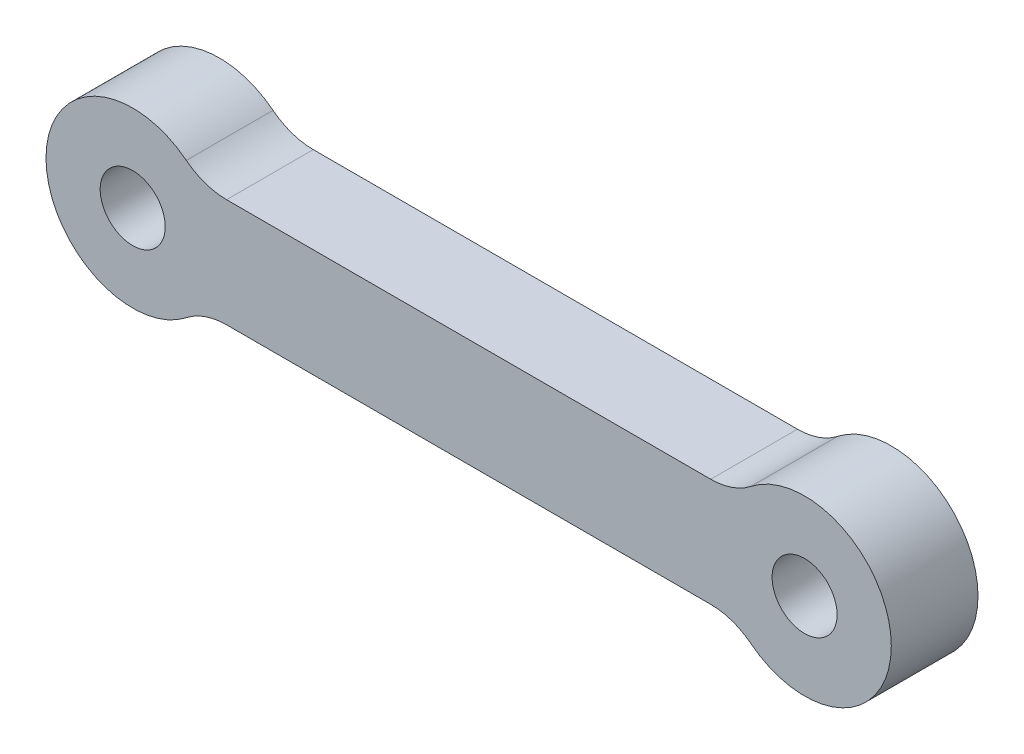
ISO-10303-21;
HEADER;
FILE_DESCRIPTION(('STEP AP214'),'2;1');
FILE_NAME('part.step','',(''),(''),'','','');
FILE_SCHEMA(('AUTOMOTIVE_DESIGN { 1 0 10303 214 1 1 1 1 }'));
ENDSEC;
DATA;
#1=APPLICATION_CONTEXT('core data for automotive mechanical design processes');
#2=APPLICATION_PROTOCOL_DEFINITION('international standard','automotive_design',2000,#1);
#3=PRODUCT_CONTEXT('',#1,'mechanical');
#4=PRODUCT('Part','Part','',(#3));
#5=PRODUCT_RELATED_PRODUCT_CATEGORY('part','',(#4));
#6=PRODUCT_DEFINITION_FORMATION('','',#4);
#7=PRODUCT_DEFINITION_CONTEXT('part definition',#1,'design');
#8=PRODUCT_DEFINITION('design','',#6,#7);
#9=PRODUCT_DEFINITION_SHAPE('','',#8);
#10=(LENGTH_UNIT() NAMED_UNIT(*) SI_UNIT(.MILLI.,.METRE.));
#11=(NAMED_UNIT(*) PLANE_ANGLE_UNIT() SI_UNIT($,.RADIAN.));
#12=(NAMED_UNIT(*) SI_UNIT($,.STERADIAN.) SOLID_ANGLE_UNIT());
#13=UNCERTAINTY_MEASURE_WITH_UNIT(LENGTH_MEASURE(1.E-05),#10,'distance_accuracy_value','');
#14=(GEOMETRIC_REPRESENTATION_CONTEXT(3) GLOBAL_UNCERTAINTY_ASSIGNED_CONTEXT((#13)) GLOBAL_UNIT_ASSIGNED_CONTEXT((#10,
#11,#12)) REPRESENTATION_CONTEXT('',''));
#15=CARTESIAN_POINT('',(0.,0.,0.));
#16=DIRECTION('',(0.,0.,1.));
#17=DIRECTION('',(1.,0.,0.));
#18=AXIS2_PLACEMENT_3D('',#15,#16,#17);
#19=CARTESIAN_POINT('',(11.2797961058988,3.83741273708224,4.));
#20=DIRECTION('',(0.,0.,1.));
#21=DIRECTION('',(1.,0.,0.));
#22=AXIS2_PLACEMENT_3D('',#19,#20,#21);
#23=PLANE('',#22);
#24=CARTESIAN_POINT('',(-15.390076875179,-1.66258726291775,4.));
#25=DIRECTION('',(0.,0.,1.));
#26=DIRECTION('',(1.,0.,0.));
#27=AXIS2_PLACEMENT_3D('',#24,#25,#26);
#28=CIRCLE('',#27,1.5);
#29=CARTESIAN_POINT('',(-13.890076875179,-1.66258726291775,4.));
#30=VERTEX_POINT('',#29);
#31=EDGE_CURVE('E150',#30,#30,#28,.T.);
#32=ORIENTED_EDGE('',*,*,#31,.F.);
#33=EDGE_LOOP('',(#32));
#34=FACE_BOUND('',#33,.T.);
#35=CARTESIAN_POINT('',(11.2797961058988,3.83741273708224,4.));
#36=DIRECTION('',(0.,0.,-1.));
#37=DIRECTION('',(1.,0.,0.));
#38=AXIS2_PLACEMENT_3D('',#35,#36,#37);
#39=CIRCLE('',#38,3.);
#40=CARTESIAN_POINT('',(13.135564828294,1.48026987993939,4.));
#41=VERTEX_POINT('',#40);
#42=CARTESIAN_POINT('',(11.2797961058988,0.837412737082244,4.));
#43=VERTEX_POINT('',#42);
#44=EDGE_CURVE('E168',#41,#43,#39,.T.);
#45=ORIENTED_EDGE('',*,*,#44,.T.);
#46=DIRECTION('',(-1.,0.,0.));
#47=VECTOR('',#46,1.);
#48=CARTESIAN_POINT('',(11.2797961058988,0.837412737082244,4.));
#49=LINE('',#48,#47);
#50=CARTESIAN_POINT('',(-11.0599498562568,0.837412737082241,4.));
#51=VERTEX_POINT('',#50);
#52=EDGE_CURVE('E104',#43,#51,#49,.T.);
#53=ORIENTED_EDGE('',*,*,#52,.T.);
#54=CARTESIAN_POINT('',(-11.0599498562568,3.83741273708224,4.));
#55=DIRECTION('',(0.,0.,-1.));
#56=DIRECTION('',(-1.,0.,0.));
#57=AXIS2_PLACEMENT_3D('',#54,#55,#56);
#58=CIRCLE('',#57,3.);
#59=CARTESIAN_POINT('',(-12.915718578652,1.48026987993939,4.));
#60=VERTEX_POINT('',#59);
#61=EDGE_CURVE('E189',#51,#60,#58,.T.);
#62=ORIENTED_EDGE('',*,*,#61,.T.);
#63=CARTESIAN_POINT('',(-15.390076875179,-1.66258726291775,4.));
#64=DIRECTION('',(0.,0.,1.));
#65=DIRECTION('',(1.,0.,0.));
#66=AXIS2_PLACEMENT_3D('',#63,#64,#65);
#67=CIRCLE('',#66,4.);
#68=CARTESIAN_POINT('',(-12.915718578652,-4.8054444057749,4.));
#69=VERTEX_POINT('',#68);
#70=EDGE_CURVE('E203',#60,#69,#67,.T.);
#71=ORIENTED_EDGE('',*,*,#70,.T.);
#72=CARTESIAN_POINT('',(-11.0599498562568,-7.16258726291776,4.));
#73=DIRECTION('',(0.,0.,-1.));
#74=DIRECTION('',(-1.,0.,0.));
#75=AXIS2_PLACEMENT_3D('',#72,#73,#74);
#76=CIRCLE('',#75,3.);
#77=CARTESIAN_POINT('',(-11.0599498562568,-4.16258726291776,4.));
#78=VERTEX_POINT('',#77);
#79=EDGE_CURVE('E123',#69,#78,#76,.T.);
#80=ORIENTED_EDGE('',*,*,#79,.T.);
#81=DIRECTION('',(1.,0.,0.));
#82=VECTOR('',#81,1.);
#83=CARTESIAN_POINT('',(-11.0599498562568,-4.16258726291776,4.));
#84=LINE('',#83,#82);
#85=CARTESIAN_POINT('',(11.2797961058988,-4.16258726291776,4.));
#86=VERTEX_POINT('',#85);
#87=EDGE_CURVE('E117',#78,#86,#84,.T.);
#88=ORIENTED_EDGE('',*,*,#87,.T.);
#89=CARTESIAN_POINT('',(11.2797961058988,-7.16258726291776,4.));
#90=DIRECTION('',(0.,0.,-1.));
#91=DIRECTION('',(-1.,0.,0.));
#92=AXIS2_PLACEMENT_3D('',#89,#90,#91);
#93=CIRCLE('',#92,3.);
#94=CARTESIAN_POINT('',(13.135564828294,-4.8054444057749,4.));
#95=VERTEX_POINT('',#94);
#96=EDGE_CURVE('E121',#86,#95,#93,.T.);
#97=ORIENTED_EDGE('',*,*,#96,.T.);
#98=CARTESIAN_POINT('',(15.609923124821,-1.66258726291775,4.));
#99=DIRECTION('',(0.,0.,1.));
#100=DIRECTION('',(1.,0.,0.));
#101=AXIS2_PLACEMENT_3D('',#98,#99,#100);
#102=CIRCLE('',#101,4.);
#103=EDGE_CURVE('E61',#95,#41,#102,.T.);
#104=ORIENTED_EDGE('',*,*,#103,.T.);
#105=EDGE_LOOP('',(#45,#53,#62,#71,#80,#88,#97,#104));
#106=FACE_BOUND('',#105,.T.);
#107=CARTESIAN_POINT('',(15.609923124821,-1.66258726291775,4.));
#108=DIRECTION('',(0.,0.,1.));
#109=DIRECTION('',(1.,0.,0.));
#110=AXIS2_PLACEMENT_3D('',#107,#108,#109);
#111=CIRCLE('',#110,1.5);
#112=CARTESIAN_POINT('',(17.109923124821,-1.66258726291775,4.));
#113=VERTEX_POINT('',#112);
#114=EDGE_CURVE('E217',#113,#113,#111,.T.);
#115=ORIENTED_EDGE('',*,*,#114,.F.);
#116=EDGE_LOOP('',(#115));
#117=FACE_BOUND('',#116,.T.);
#118=ADVANCED_FACE('F43',(#34,#106,#117),#23,.T.);
#119=CARTESIAN_POINT('',(11.2797961058988,3.83741273708224,0.));
#120=DIRECTION('',(0.,0.,1.));
#121=DIRECTION('',(1.,0.,0.));
#122=AXIS2_PLACEMENT_3D('',#119,#120,#121);
#123=PLANE('',#122);
#124=CARTESIAN_POINT('',(11.2797961058988,3.83741273708224,0.));
#125=DIRECTION('',(0.,0.,-1.));
#126=DIRECTION('',(1.,0.,0.));
#127=AXIS2_PLACEMENT_3D('',#124,#125,#126);
#128=CIRCLE('',#127,3.);
#129=CARTESIAN_POINT('',(13.135564828294,1.48026987993939,0.));
#130=VERTEX_POINT('',#129);
#131=CARTESIAN_POINT('',(11.2797961058988,0.837412737082244,0.));
#132=VERTEX_POINT('',#131);
#133=EDGE_CURVE('E145',#130,#132,#128,.T.);
#134=ORIENTED_EDGE('',*,*,#133,.F.);
#135=CARTESIAN_POINT('',(15.609923124821,-1.66258726291775,0.));
#136=DIRECTION('',(0.,0.,1.));
#137=DIRECTION('',(1.,0.,0.));
#138=AXIS2_PLACEMENT_3D('',#135,#136,#137);
#139=CIRCLE('',#138,4.);
#140=CARTESIAN_POINT('',(13.135564828294,-4.8054444057749,0.));
#141=VERTEX_POINT('',#140);
#142=EDGE_CURVE('E96',#141,#130,#139,.T.);
#143=ORIENTED_EDGE('',*,*,#142,.F.);
#144=CARTESIAN_POINT('',(11.2797961058988,-7.16258726291776,0.));
#145=DIRECTION('',(0.,0.,-1.));
#146=DIRECTION('',(-1.,0.,0.));
#147=AXIS2_PLACEMENT_3D('',#144,#145,#146);
#148=CIRCLE('',#147,3.);
#149=CARTESIAN_POINT('',(11.2797961058988,-4.16258726291776,0.));
#150=VERTEX_POINT('',#149);
#151=EDGE_CURVE('E90',#150,#141,#148,.T.);
#152=ORIENTED_EDGE('',*,*,#151,.F.);
#153=DIRECTION('',(1.,0.,0.));
#154=VECTOR('',#153,1.);
#155=CARTESIAN_POINT('',(-11.0599498562568,-4.16258726291776,0.));
#156=LINE('',#155,#154);
#157=CARTESIAN_POINT('',(-11.0599498562568,-4.16258726291776,0.));
#158=VERTEX_POINT('',#157);
#159=EDGE_CURVE('E132',#158,#150,#156,.T.);
#160=ORIENTED_EDGE('',*,*,#159,.F.);
#161=CARTESIAN_POINT('',(-11.0599498562568,-7.16258726291776,0.));
#162=DIRECTION('',(0.,0.,-1.));
#163=DIRECTION('',(-1.,0.,0.));
#164=AXIS2_PLACEMENT_3D('',#161,#162,#163);
#165=CIRCLE('',#164,3.);
#166=CARTESIAN_POINT('',(-12.915718578652,-4.8054444057749,0.));
#167=VERTEX_POINT('',#166);
#168=EDGE_CURVE('E159',#167,#158,#165,.T.);
#169=ORIENTED_EDGE('',*,*,#168,.F.);
#170=CARTESIAN_POINT('',(-15.390076875179,-1.66258726291775,0.));
#171=DIRECTION('',(0.,0.,1.));
#172=DIRECTION('',(1.,0.,0.));
#173=AXIS2_PLACEMENT_3D('',#170,#171,#172);
#174=CIRCLE('',#173,4.);
#175=CARTESIAN_POINT('',(-12.915718578652,1.48026987993939,0.));
#176=VERTEX_POINT('',#175);
#177=EDGE_CURVE('E156',#176,#167,#174,.T.);
#178=ORIENTED_EDGE('',*,*,#177,.F.);
#179=CARTESIAN_POINT('',(-11.0599498562568,3.83741273708224,0.));
#180=DIRECTION('',(0.,0.,-1.));
#181=DIRECTION('',(-1.,0.,0.));
#182=AXIS2_PLACEMENT_3D('',#179,#180,#181);
#183=CIRCLE('',#182,3.);
#184=CARTESIAN_POINT('',(-11.0599498562568,0.837412737082241,0.));
#185=VERTEX_POINT('',#184);
#186=EDGE_CURVE('E153',#185,#176,#183,.T.);
#187=ORIENTED_EDGE('',*,*,#186,.F.);
#188=DIRECTION('',(-1.,0.,0.));
#189=VECTOR('',#188,1.);
#190=CARTESIAN_POINT('',(11.2797961058988,0.837412737082244,0.));
#191=LINE('',#190,#189);
#192=EDGE_CURVE('E149',#132,#185,#191,.T.);
#193=ORIENTED_EDGE('',*,*,#192,.F.);
#194=EDGE_LOOP('',(#134,#143,#152,#160,#169,#178,#187,#193));
#195=FACE_BOUND('',#194,.T.);
#196=CARTESIAN_POINT('',(-15.390076875179,-1.66258726291775,0.));
#197=DIRECTION('',(0.,0.,1.));
#198=DIRECTION('',(1.,0.,0.));
#199=AXIS2_PLACEMENT_3D('',#196,#197,#198);
#200=CIRCLE('',#199,1.5);
#201=CARTESIAN_POINT('',(-13.890076875179,-1.66258726291775,0.));
#202=VERTEX_POINT('',#201);
#203=EDGE_CURVE('E213',#202,#202,#200,.T.);
#204=ORIENTED_EDGE('',*,*,#203,.T.);
#205=EDGE_LOOP('',(#204));
#206=FACE_BOUND('',#205,.T.);
#207=CARTESIAN_POINT('',(15.609923124821,-1.66258726291775,0.));
#208=DIRECTION('',(0.,0.,1.));
#209=DIRECTION('',(1.,0.,0.));
#210=AXIS2_PLACEMENT_3D('',#207,#208,#209);
#211=CIRCLE('',#210,1.5);
#212=CARTESIAN_POINT('',(17.109923124821,-1.66258726291775,0.));
#213=VERTEX_POINT('',#212);
#214=EDGE_CURVE('E221',#213,#213,#211,.T.);
#215=ORIENTED_EDGE('',*,*,#214,.T.);
#216=EDGE_LOOP('',(#215));
#217=FACE_BOUND('',#216,.T.);
#218=ADVANCED_FACE('F193',(#195,#206,#217),#123,.F.);
#219=CARTESIAN_POINT('',(11.2797961058988,3.83741273708224,4.));
#220=DIRECTION('',(0.,0.,-1.));
#221=DIRECTION('',(-1.,0.,0.));
#222=AXIS2_PLACEMENT_3D('',#219,#220,#221);
#223=CYLINDRICAL_SURFACE('',#222,3.);
#224=ORIENTED_EDGE('',*,*,#133,.T.);
#225=DIRECTION('',(0.,0.,-1.));
#226=VECTOR('',#225,1.);
#227=CARTESIAN_POINT('',(11.2797961058988,0.837412737082244,4.));
#228=LINE('',#227,#226);
#229=EDGE_CURVE('E11',#43,#132,#228,.T.);
#230=ORIENTED_EDGE('',*,*,#229,.F.);
#231=ORIENTED_EDGE('',*,*,#44,.F.);
#232=DIRECTION('',(0.,0.,-1.));
#233=VECTOR('',#232,1.);
#234=CARTESIAN_POINT('',(13.135564828294,1.48026987993939,4.));
#235=LINE('',#234,#233);
#236=EDGE_CURVE('E141',#41,#130,#235,.T.);
#237=ORIENTED_EDGE('',*,*,#236,.T.);
#238=EDGE_LOOP('',(#224,#230,#231,#237));
#239=FACE_BOUND('',#238,.T.);
#240=ADVANCED_FACE('F45',(#239),#223,.F.);
#241=CARTESIAN_POINT('',(11.2797961058988,0.837412737082244,4.));
#242=DIRECTION('',(0.,-1.,0.));
#243=DIRECTION('',(1.,0.,0.));
#244=AXIS2_PLACEMENT_3D('',#241,#242,#243);
#245=PLANE('',#244);
#246=ORIENTED_EDGE('',*,*,#192,.T.);
#247=DIRECTION('',(0.,0.,-1.));
#248=VECTOR('',#247,1.);
#249=CARTESIAN_POINT('',(-11.0599498562568,0.837412737082241,4.));
#250=LINE('',#249,#248);
#251=EDGE_CURVE('E53',#51,#185,#250,.T.);
#252=ORIENTED_EDGE('',*,*,#251,.F.);
#253=ORIENTED_EDGE('',*,*,#52,.F.);
#254=ORIENTED_EDGE('',*,*,#229,.T.);
#255=EDGE_LOOP('',(#246,#252,#253,#254));
#256=FACE_BOUND('',#255,.T.);
#257=ADVANCED_FACE('F255',(#256),#245,.F.);
#258=CARTESIAN_POINT('',(-11.0599498562568,3.83741273708224,4.));
#259=DIRECTION('',(0.,0.,-1.));
#260=DIRECTION('',(-1.,0.,0.));
#261=AXIS2_PLACEMENT_3D('',#258,#259,#260);
#262=CYLINDRICAL_SURFACE('',#261,3.);
#263=ORIENTED_EDGE('',*,*,#186,.T.);
#264=DIRECTION('',(0.,0.,-1.));
#265=VECTOR('',#264,1.);
#266=CARTESIAN_POINT('',(-12.915718578652,1.48026987993939,4.));
#267=LINE('',#266,#265);
#268=EDGE_CURVE('E179',#60,#176,#267,.T.);
#269=ORIENTED_EDGE('',*,*,#268,.F.);
#270=ORIENTED_EDGE('',*,*,#61,.F.);
#271=ORIENTED_EDGE('',*,*,#251,.T.);
#272=EDGE_LOOP('',(#263,#269,#270,#271));
#273=FACE_BOUND('',#272,.T.);
#274=ADVANCED_FACE('F187',(#273),#262,.F.);
#275=CARTESIAN_POINT('',(-15.390076875179,-1.66258726291775,4.));
#276=DIRECTION('',(0.,0.,-1.));
#277=DIRECTION('',(-1.,0.,0.));
#278=AXIS2_PLACEMENT_3D('',#275,#276,#277);
#279=CYLINDRICAL_SURFACE('',#278,4.);
#280=ORIENTED_EDGE('',*,*,#177,.T.);
#281=DIRECTION('',(0.,0.,-1.));
#282=VECTOR('',#281,1.);
#283=CARTESIAN_POINT('',(-12.915718578652,-4.8054444057749,4.));
#284=LINE('',#283,#282);
#285=EDGE_CURVE('E175',#69,#167,#284,.T.);
#286=ORIENTED_EDGE('',*,*,#285,.F.);
#287=ORIENTED_EDGE('',*,*,#70,.F.);
#288=ORIENTED_EDGE('',*,*,#268,.T.);
#289=EDGE_LOOP('',(#280,#286,#287,#288));
#290=FACE_BOUND('',#289,.T.);
#291=ADVANCED_FACE('F198',(#290),#279,.T.);
#292=CARTESIAN_POINT('',(-11.0599498562568,-7.16258726291776,4.));
#293=DIRECTION('',(0.,0.,-1.));
#294=DIRECTION('',(-1.,0.,0.));
#295=AXIS2_PLACEMENT_3D('',#292,#293,#294);
#296=CYLINDRICAL_SURFACE('',#295,3.);
#297=ORIENTED_EDGE('',*,*,#168,.T.);
#298=DIRECTION('',(0.,0.,-1.));
#299=VECTOR('',#298,1.);
#300=CARTESIAN_POINT('',(-11.0599498562568,-4.16258726291776,4.));
#301=LINE('',#300,#299);
#302=EDGE_CURVE('E134',#78,#158,#301,.T.);
#303=ORIENTED_EDGE('',*,*,#302,.F.);
#304=ORIENTED_EDGE('',*,*,#79,.F.);
#305=ORIENTED_EDGE('',*,*,#285,.T.);
#306=EDGE_LOOP('',(#297,#303,#304,#305));
#307=FACE_BOUND('',#306,.T.);
#308=ADVANCED_FACE('F201',(#307),#296,.F.);
#309=CARTESIAN_POINT('',(-11.0599498562568,-4.16258726291776,4.));
#310=DIRECTION('',(0.,1.,0.));
#311=DIRECTION('',(-1.,0.,0.));
#312=AXIS2_PLACEMENT_3D('',#309,#310,#311);
#313=PLANE('',#312);
#314=ORIENTED_EDGE('',*,*,#159,.T.);
#315=DIRECTION('',(0.,0.,-1.));
#316=VECTOR('',#315,1.);
#317=CARTESIAN_POINT('',(11.2797961058988,-4.16258726291776,4.));
#318=LINE('',#317,#316);
#319=EDGE_CURVE('E129',#86,#150,#318,.T.);
#320=ORIENTED_EDGE('',*,*,#319,.F.);
#321=ORIENTED_EDGE('',*,*,#87,.F.);
#322=ORIENTED_EDGE('',*,*,#302,.T.);
#323=EDGE_LOOP('',(#314,#320,#321,#322));
#324=FACE_BOUND('',#323,.T.);
#325=ADVANCED_FACE('F130',(#324),#313,.F.);
#326=CARTESIAN_POINT('',(11.2797961058988,-7.16258726291776,4.));
#327=DIRECTION('',(0.,0.,-1.));
#328=DIRECTION('',(-1.,0.,0.));
#329=AXIS2_PLACEMENT_3D('',#326,#327,#328);
#330=CYLINDRICAL_SURFACE('',#329,3.);
#331=ORIENTED_EDGE('',*,*,#151,.T.);
#332=DIRECTION('',(0.,0.,-1.));
#333=VECTOR('',#332,1.);
#334=CARTESIAN_POINT('',(13.135564828294,-4.8054444057749,4.));
#335=LINE('',#334,#333);
#336=EDGE_CURVE('E135',#95,#141,#335,.T.);
#337=ORIENTED_EDGE('',*,*,#336,.F.);
#338=ORIENTED_EDGE('',*,*,#96,.F.);
#339=ORIENTED_EDGE('',*,*,#319,.T.);
#340=EDGE_LOOP('',(#331,#337,#338,#339));
#341=FACE_BOUND('',#340,.T.);
#342=ADVANCED_FACE('F137',(#341),#330,.F.);
#343=CARTESIAN_POINT('',(15.609923124821,-1.66258726291775,4.));
#344=DIRECTION('',(0.,0.,-1.));
#345=DIRECTION('',(-1.,0.,0.));
#346=AXIS2_PLACEMENT_3D('',#343,#344,#345);
#347=CYLINDRICAL_SURFACE('',#346,4.);
#348=ORIENTED_EDGE('',*,*,#142,.T.);
#349=ORIENTED_EDGE('',*,*,#236,.F.);
#350=ORIENTED_EDGE('',*,*,#103,.F.);
#351=ORIENTED_EDGE('',*,*,#336,.T.);
#352=EDGE_LOOP('',(#348,#349,#350,#351));
#353=FACE_BOUND('',#352,.T.);
#354=ADVANCED_FACE('F243',(#353),#347,.T.);
#355=CARTESIAN_POINT('',(-15.390076875179,-1.66258726291775,4.));
#356=DIRECTION('',(0.,0.,-1.));
#357=DIRECTION('',(-1.,0.,0.));
#358=AXIS2_PLACEMENT_3D('',#355,#356,#357);
#359=CYLINDRICAL_SURFACE('',#358,1.5);
#360=ORIENTED_EDGE('',*,*,#31,.T.);
#361=EDGE_LOOP('',(#360));
#362=FACE_BOUND('',#361,.T.);
#363=ORIENTED_EDGE('',*,*,#203,.F.);
#364=EDGE_LOOP('',(#363));
#365=FACE_BOUND('',#364,.T.);
#366=ADVANCED_FACE('F240',(#362,#365),#359,.F.);
#367=CARTESIAN_POINT('',(15.609923124821,-1.66258726291775,4.));
#368=DIRECTION('',(0.,0.,-1.));
#369=DIRECTION('',(-1.,0.,0.));
#370=AXIS2_PLACEMENT_3D('',#367,#368,#369);
#371=CYLINDRICAL_SURFACE('',#370,1.5);
#372=ORIENTED_EDGE('',*,*,#114,.T.);
#373=EDGE_LOOP('',(#372));
#374=FACE_BOUND('',#373,.T.);
#375=ORIENTED_EDGE('',*,*,#214,.F.);
#376=EDGE_LOOP('',(#375));
#377=FACE_BOUND('',#376,.T.);
#378=ADVANCED_FACE('F229',(#374,#377),#371,.F.);
#379=CLOSED_SHELL('',(#118,#218,#240,#257,#274,#291,#308,#325,#342,#354,#366,#378));
#380=MANIFOLD_SOLID_BREP('B2',#379);
#381=ADVANCED_BREP_SHAPE_REPRESENTATION('',(#18,#380),#14);
#382=SHAPE_DEFINITION_REPRESENTATION(#9,#381);
ENDSEC;
END-ISO-10303-21;
